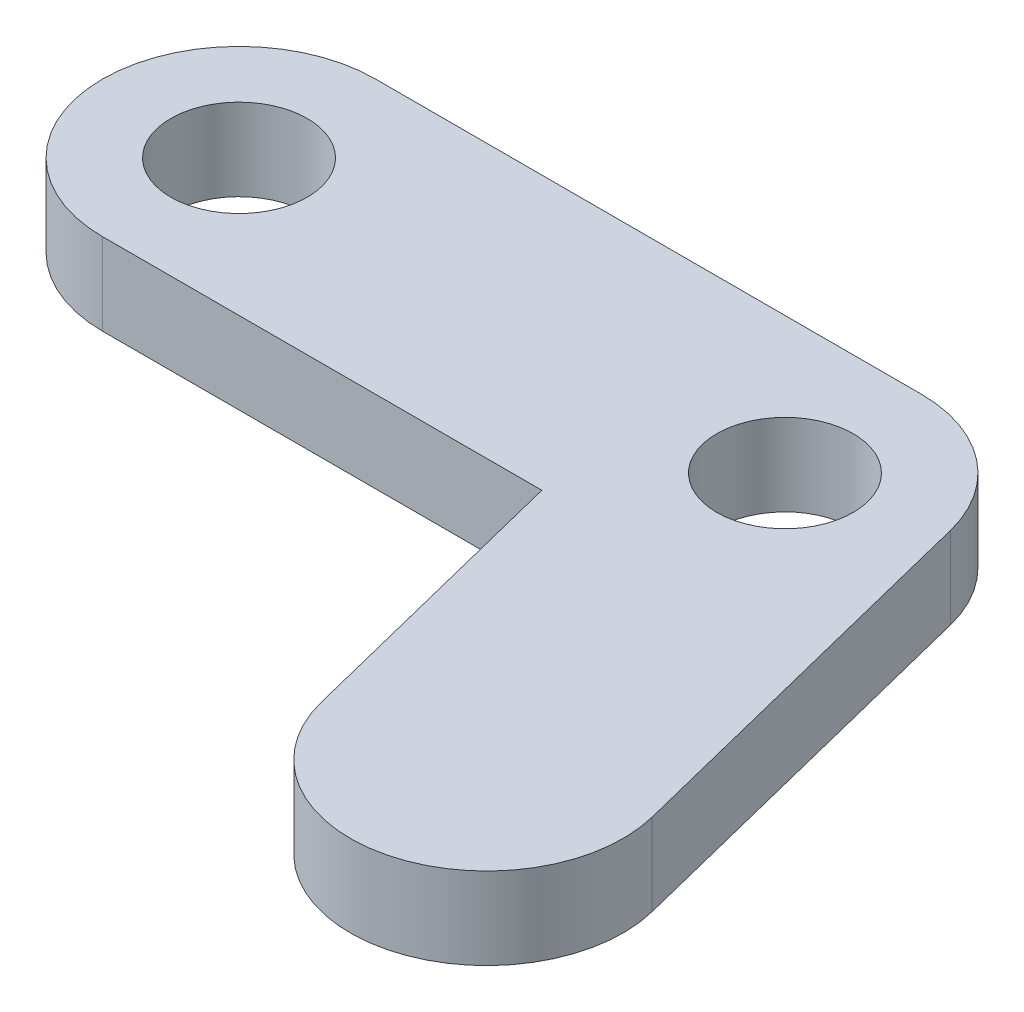
ISO-10303-21;
HEADER;
FILE_DESCRIPTION(('STEP AP214'),'2;1');
FILE_NAME('part.step','',(''),(''),'','','');
FILE_SCHEMA(('AUTOMOTIVE_DESIGN { 1 0 10303 214 1 1 1 1 }'));
ENDSEC;
DATA;
#1=APPLICATION_CONTEXT('core data for automotive mechanical design processes');
#2=APPLICATION_PROTOCOL_DEFINITION('international standard','automotive_design',2000,#1);
#3=PRODUCT_CONTEXT('',#1,'mechanical');
#4=PRODUCT('Part','Part','',(#3));
#5=PRODUCT_RELATED_PRODUCT_CATEGORY('part','',(#4));
#6=PRODUCT_DEFINITION_FORMATION('','',#4);
#7=PRODUCT_DEFINITION_CONTEXT('part definition',#1,'design');
#8=PRODUCT_DEFINITION('design','',#6,#7);
#9=PRODUCT_DEFINITION_SHAPE('','',#8);
#10=(LENGTH_UNIT() NAMED_UNIT(*) SI_UNIT(.MILLI.,.METRE.));
#11=(NAMED_UNIT(*) PLANE_ANGLE_UNIT() SI_UNIT($,.RADIAN.));
#12=(NAMED_UNIT(*) SI_UNIT($,.STERADIAN.) SOLID_ANGLE_UNIT());
#13=UNCERTAINTY_MEASURE_WITH_UNIT(LENGTH_MEASURE(1.E-05),#10,'distance_accuracy_value','');
#14=(GEOMETRIC_REPRESENTATION_CONTEXT(3) GLOBAL_UNCERTAINTY_ASSIGNED_CONTEXT((#13)) GLOBAL_UNIT_ASSIGNED_CONTEXT((#10,
#11,#12)) REPRESENTATION_CONTEXT('',''));
#15=CARTESIAN_POINT('',(0.,0.,0.));
#16=DIRECTION('',(0.,0.,1.));
#17=DIRECTION('',(1.,0.,0.));
#18=AXIS2_PLACEMENT_3D('',#15,#16,#17);
#19=CARTESIAN_POINT('',(23.6809545599693,3.,-5.90432510585719));
#20=DIRECTION('',(0.970295726275997,0.,-0.241921895599665));
#21=DIRECTION('',(-0.241921895599665,0.,-0.970295726275997));
#22=AXIS2_PLACEMENT_3D('',#19,#20,#21);
#23=PLANE('',#22);
#24=DIRECTION('',(0.241921895599665,0.,0.970295726275997));
#25=VECTOR('',#24,1.);
#26=CARTESIAN_POINT('',(23.6809545599693,0.,-5.90432510585719));
#27=LINE('',#26,#25);
#28=CARTESIAN_POINT('',(24.85147863138,0.,-1.20960947799832));
#29=VERTEX_POINT('',#28);
#30=CARTESIAN_POINT('',(28.480307065375,0.,13.3448264161416));
#31=VERTEX_POINT('',#30);
#32=EDGE_CURVE('E143',#29,#31,#27,.T.);
#33=ORIENTED_EDGE('',*,*,#32,.F.);
#34=DIRECTION('',(0.,-1.,0.));
#35=VECTOR('',#34,1.);
#36=CARTESIAN_POINT('',(24.85147863138,3.,-1.20960947799832));
#37=LINE('',#36,#35);
#38=CARTESIAN_POINT('',(24.85147863138,3.,-1.20960947799832));
#39=VERTEX_POINT('',#38);
#40=EDGE_CURVE('E11',#39,#29,#37,.T.);
#41=ORIENTED_EDGE('',*,*,#40,.F.);
#42=DIRECTION('',(0.241921895599665,0.,0.970295726275997));
#43=VECTOR('',#42,1.);
#44=CARTESIAN_POINT('',(23.6809545599693,3.,-5.90432510585719));
#45=LINE('',#44,#43);
#46=CARTESIAN_POINT('',(28.480307065375,3.,13.3448264161416));
#47=VERTEX_POINT('',#46);
#48=EDGE_CURVE('E173',#39,#47,#45,.T.);
#49=ORIENTED_EDGE('',*,*,#48,.T.);
#50=DIRECTION('',(0.,-1.,0.));
#51=VECTOR('',#50,1.);
#52=CARTESIAN_POINT('',(28.480307065375,3.,13.3448264161416));
#53=LINE('',#52,#51);
#54=EDGE_CURVE('E90',#47,#31,#53,.T.);
#55=ORIENTED_EDGE('',*,*,#54,.T.);
#56=EDGE_LOOP('',(#33,#41,#49,#55));
#57=FACE_BOUND('',#56,.T.);
#58=ADVANCED_FACE('F41',(#57),#23,.T.);
#59=CARTESIAN_POINT('',(20.,3.,0.));
#60=DIRECTION('',(0.,-1.,0.));
#61=DIRECTION('',(0.,0.,-1.));
#62=AXIS2_PLACEMENT_3D('',#59,#60,#61);
#63=CYLINDRICAL_SURFACE('',#62,5.);
#64=CARTESIAN_POINT('',(20.,0.,0.));
#65=DIRECTION('',(0.,1.,0.));
#66=DIRECTION('',(0.,0.,1.));
#67=AXIS2_PLACEMENT_3D('',#64,#65,#66);
#68=CIRCLE('',#67,5.);
#69=CARTESIAN_POINT('',(20.,0.,-5.));
#70=VERTEX_POINT('',#69);
#71=EDGE_CURVE('E147',#29,#70,#68,.T.);
#72=ORIENTED_EDGE('',*,*,#71,.T.);
#73=DIRECTION('',(0.,-1.,0.));
#74=VECTOR('',#73,1.);
#75=CARTESIAN_POINT('',(20.,3.,-5.));
#76=LINE('',#75,#74);
#77=CARTESIAN_POINT('',(20.,3.,-5.));
#78=VERTEX_POINT('',#77);
#79=EDGE_CURVE('E50',#78,#70,#76,.T.);
#80=ORIENTED_EDGE('',*,*,#79,.F.);
#81=CARTESIAN_POINT('',(20.,3.,0.));
#82=DIRECTION('',(0.,1.,0.));
#83=DIRECTION('',(0.,0.,1.));
#84=AXIS2_PLACEMENT_3D('',#81,#82,#83);
#85=CIRCLE('',#84,5.);
#86=EDGE_CURVE('E199',#39,#78,#85,.T.);
#87=ORIENTED_EDGE('',*,*,#86,.F.);
#88=ORIENTED_EDGE('',*,*,#40,.T.);
#89=EDGE_LOOP('',(#72,#80,#87,#88));
#90=FACE_BOUND('',#89,.T.);
#91=ADVANCED_FACE('F191',(#90),#63,.T.);
#92=CARTESIAN_POINT('',(0.,3.,-5.));
#93=DIRECTION('',(0.,0.,-1.));
#94=DIRECTION('',(-1.,0.,0.));
#95=AXIS2_PLACEMENT_3D('',#92,#93,#94);
#96=PLANE('',#95);
#97=DIRECTION('',(1.,0.,0.));
#98=VECTOR('',#97,1.);
#99=CARTESIAN_POINT('',(0.,0.,-5.));
#100=LINE('',#99,#98);
#101=CARTESIAN_POINT('',(0.,0.,-5.));
#102=VERTEX_POINT('',#101);
#103=EDGE_CURVE('E151',#102,#70,#100,.T.);
#104=ORIENTED_EDGE('',*,*,#103,.F.);
#105=DIRECTION('',(0.,-1.,0.));
#106=VECTOR('',#105,1.);
#107=CARTESIAN_POINT('',(0.,3.,-5.));
#108=LINE('',#107,#106);
#109=CARTESIAN_POINT('',(0.,3.,-5.));
#110=VERTEX_POINT('',#109);
#111=EDGE_CURVE('E180',#110,#102,#108,.T.);
#112=ORIENTED_EDGE('',*,*,#111,.F.);
#113=DIRECTION('',(1.,0.,0.));
#114=VECTOR('',#113,1.);
#115=CARTESIAN_POINT('',(0.,3.,-5.));
#116=LINE('',#115,#114);
#117=EDGE_CURVE('E188',#110,#78,#116,.T.);
#118=ORIENTED_EDGE('',*,*,#117,.T.);
#119=ORIENTED_EDGE('',*,*,#79,.T.);
#120=EDGE_LOOP('',(#104,#112,#118,#119));
#121=FACE_BOUND('',#120,.T.);
#122=ADVANCED_FACE('F187',(#121),#96,.T.);
#123=CARTESIAN_POINT('',(0.,3.,0.));
#124=DIRECTION('',(0.,-1.,0.));
#125=DIRECTION('',(0.,0.,-1.));
#126=AXIS2_PLACEMENT_3D('',#123,#124,#125);
#127=CYLINDRICAL_SURFACE('',#126,5.);
#128=CARTESIAN_POINT('',(0.,0.,0.));
#129=DIRECTION('',(0.,1.,0.));
#130=DIRECTION('',(0.,0.,1.));
#131=AXIS2_PLACEMENT_3D('',#128,#129,#130);
#132=CIRCLE('',#131,5.);
#133=CARTESIAN_POINT('',(0.,0.,5.));
#134=VERTEX_POINT('',#133);
#135=EDGE_CURVE('E155',#102,#134,#132,.T.);
#136=ORIENTED_EDGE('',*,*,#135,.T.);
#137=DIRECTION('',(0.,-1.,0.));
#138=VECTOR('',#137,1.);
#139=CARTESIAN_POINT('',(0.,3.,5.));
#140=LINE('',#139,#138);
#141=CARTESIAN_POINT('',(0.,3.,5.));
#142=VERTEX_POINT('',#141);
#143=EDGE_CURVE('E125',#142,#134,#140,.T.);
#144=ORIENTED_EDGE('',*,*,#143,.F.);
#145=CARTESIAN_POINT('',(0.,3.,0.));
#146=DIRECTION('',(0.,1.,0.));
#147=DIRECTION('',(0.,0.,1.));
#148=AXIS2_PLACEMENT_3D('',#145,#146,#147);
#149=CIRCLE('',#148,5.);
#150=EDGE_CURVE('E114',#110,#142,#149,.T.);
#151=ORIENTED_EDGE('',*,*,#150,.F.);
#152=ORIENTED_EDGE('',*,*,#111,.T.);
#153=EDGE_LOOP('',(#136,#144,#151,#152));
#154=FACE_BOUND('',#153,.T.);
#155=ADVANCED_FACE('F197',(#154),#127,.T.);
#156=CARTESIAN_POINT('',(0.,3.,5.));
#157=DIRECTION('',(0.,0.,-1.));
#158=DIRECTION('',(-1.,0.,0.));
#159=AXIS2_PLACEMENT_3D('',#156,#157,#158);
#160=PLANE('',#159);
#161=DIRECTION('',(1.,0.,0.));
#162=VECTOR('',#161,1.);
#163=CARTESIAN_POINT('',(0.,0.,5.));
#164=LINE('',#163,#162);
#165=CARTESIAN_POINT('',(16.0935718674664,0.,5.));
#166=VERTEX_POINT('',#165);
#167=EDGE_CURVE('E123',#134,#166,#164,.T.);
#168=ORIENTED_EDGE('',*,*,#167,.T.);
#169=DIRECTION('',(0.,-1.,0.));
#170=VECTOR('',#169,1.);
#171=CARTESIAN_POINT('',(16.0935718674664,3.,5.));
#172=LINE('',#171,#170);
#173=CARTESIAN_POINT('',(16.0935718674664,3.,5.));
#174=VERTEX_POINT('',#173);
#175=EDGE_CURVE('E120',#174,#166,#172,.T.);
#176=ORIENTED_EDGE('',*,*,#175,.F.);
#177=DIRECTION('',(1.,0.,0.));
#178=VECTOR('',#177,1.);
#179=CARTESIAN_POINT('',(0.,3.,5.));
#180=LINE('',#179,#178);
#181=EDGE_CURVE('E106',#142,#174,#180,.T.);
#182=ORIENTED_EDGE('',*,*,#181,.F.);
#183=ORIENTED_EDGE('',*,*,#143,.T.);
#184=EDGE_LOOP('',(#168,#176,#182,#183));
#185=FACE_BOUND('',#184,.T.);
#186=ADVANCED_FACE('F121',(#185),#160,.F.);
#187=CARTESIAN_POINT('',(13.9779972972093,3.,-3.48510614986053));
#188=DIRECTION('',(0.970295726275997,0.,-0.241921895599664));
#189=DIRECTION('',(-0.241921895599664,0.,-0.970295726275997));
#190=AXIS2_PLACEMENT_3D('',#187,#188,#189);
#191=PLANE('',#190);
#192=DIRECTION('',(0.241921895599664,0.,0.970295726275997));
#193=VECTOR('',#192,1.);
#194=CARTESIAN_POINT('',(13.9779972972093,0.,-3.48510614986053));
#195=LINE('',#194,#193);
#196=CARTESIAN_POINT('',(18.777349802615,0.,15.7640453721383));
#197=VERTEX_POINT('',#196);
#198=EDGE_CURVE('E83',#166,#197,#195,.T.);
#199=ORIENTED_EDGE('',*,*,#198,.T.);
#200=DIRECTION('',(0.,-1.,0.));
#201=VECTOR('',#200,1.);
#202=CARTESIAN_POINT('',(18.777349802615,3.,15.7640453721383));
#203=LINE('',#202,#201);
#204=CARTESIAN_POINT('',(18.777349802615,3.,15.7640453721383));
#205=VERTEX_POINT('',#204);
#206=EDGE_CURVE('E126',#205,#197,#203,.T.);
#207=ORIENTED_EDGE('',*,*,#206,.F.);
#208=DIRECTION('',(0.241921895599664,0.,0.970295726275997));
#209=VECTOR('',#208,1.);
#210=CARTESIAN_POINT('',(13.9779972972093,3.,-3.48510614986053));
#211=LINE('',#210,#209);
#212=EDGE_CURVE('E111',#174,#205,#211,.T.);
#213=ORIENTED_EDGE('',*,*,#212,.F.);
#214=ORIENTED_EDGE('',*,*,#175,.T.);
#215=EDGE_LOOP('',(#199,#207,#213,#214));
#216=FACE_BOUND('',#215,.T.);
#217=ADVANCED_FACE('F128',(#216),#191,.F.);
#218=CARTESIAN_POINT('',(0.,3.,0.));
#219=DIRECTION('',(0.,-1.,0.));
#220=DIRECTION('',(0.,0.,-1.));
#221=AXIS2_PLACEMENT_3D('',#218,#219,#220);
#222=CYLINDRICAL_SURFACE('',#221,2.5);
#223=CARTESIAN_POINT('',(0.,3.,0.));
#224=DIRECTION('',(0.,1.,0.));
#225=DIRECTION('',(0.,0.,1.));
#226=AXIS2_PLACEMENT_3D('',#223,#224,#225);
#227=CIRCLE('',#226,2.5);
#228=CARTESIAN_POINT('',(0.,3.,2.5));
#229=VERTEX_POINT('',#228);
#230=EDGE_CURVE('E132',#229,#229,#227,.T.);
#231=ORIENTED_EDGE('',*,*,#230,.T.);
#232=EDGE_LOOP('',(#231));
#233=FACE_BOUND('',#232,.T.);
#234=CARTESIAN_POINT('',(0.,0.,0.));
#235=DIRECTION('',(0.,1.,0.));
#236=DIRECTION('',(0.,0.,1.));
#237=AXIS2_PLACEMENT_3D('',#234,#235,#236);
#238=CIRCLE('',#237,2.5);
#239=CARTESIAN_POINT('',(0.,0.,2.5));
#240=VERTEX_POINT('',#239);
#241=EDGE_CURVE('E165',#240,#240,#238,.T.);
#242=ORIENTED_EDGE('',*,*,#241,.F.);
#243=EDGE_LOOP('',(#242));
#244=FACE_BOUND('',#243,.T.);
#245=ADVANCED_FACE('F221',(#233,#244),#222,.F.);
#246=CARTESIAN_POINT('',(23.628828433995,3.,14.55443589414));
#247=DIRECTION('',(0.,-1.,0.));
#248=DIRECTION('',(0.,0.,-1.));
#249=AXIS2_PLACEMENT_3D('',#246,#247,#248);
#250=CYLINDRICAL_SURFACE('',#249,5.);
#251=CARTESIAN_POINT('',(23.628828433995,0.,14.55443589414));
#252=DIRECTION('',(0.,1.,0.));
#253=DIRECTION('',(0.,0.,1.));
#254=AXIS2_PLACEMENT_3D('',#251,#252,#253);
#255=CIRCLE('',#254,5.);
#256=EDGE_CURVE('E162',#197,#31,#255,.T.);
#257=ORIENTED_EDGE('',*,*,#256,.T.);
#258=ORIENTED_EDGE('',*,*,#54,.F.);
#259=CARTESIAN_POINT('',(23.628828433995,3.,14.55443589414));
#260=DIRECTION('',(0.,1.,0.));
#261=DIRECTION('',(0.,0.,1.));
#262=AXIS2_PLACEMENT_3D('',#259,#260,#261);
#263=CIRCLE('',#262,5.);
#264=EDGE_CURVE('E58',#205,#47,#263,.T.);
#265=ORIENTED_EDGE('',*,*,#264,.F.);
#266=ORIENTED_EDGE('',*,*,#206,.T.);
#267=EDGE_LOOP('',(#257,#258,#265,#266));
#268=FACE_BOUND('',#267,.T.);
#269=ADVANCED_FACE('F222',(#268),#250,.T.);
#270=CARTESIAN_POINT('',(20.,3.,0.));
#271=DIRECTION('',(0.,-1.,0.));
#272=DIRECTION('',(0.,0.,-1.));
#273=AXIS2_PLACEMENT_3D('',#270,#271,#272);
#274=CYLINDRICAL_SURFACE('',#273,2.49999999999999);
#275=CARTESIAN_POINT('',(20.,3.,0.));
#276=DIRECTION('',(0.,1.,0.));
#277=DIRECTION('',(0.,0.,1.));
#278=AXIS2_PLACEMENT_3D('',#275,#276,#277);
#279=CIRCLE('',#278,2.49999999999999);
#280=CARTESIAN_POINT('',(20.,3.,2.49999999999999));
#281=VERTEX_POINT('',#280);
#282=EDGE_CURVE('E139',#281,#281,#279,.T.);
#283=ORIENTED_EDGE('',*,*,#282,.T.);
#284=EDGE_LOOP('',(#283));
#285=FACE_BOUND('',#284,.T.);
#286=CARTESIAN_POINT('',(20.,0.,0.));
#287=DIRECTION('',(0.,1.,0.));
#288=DIRECTION('',(0.,0.,1.));
#289=AXIS2_PLACEMENT_3D('',#286,#287,#288);
#290=CIRCLE('',#289,2.49999999999999);
#291=CARTESIAN_POINT('',(20.,0.,2.49999999999999));
#292=VERTEX_POINT('',#291);
#293=EDGE_CURVE('E169',#292,#292,#290,.T.);
#294=ORIENTED_EDGE('',*,*,#293,.F.);
#295=EDGE_LOOP('',(#294));
#296=FACE_BOUND('',#295,.T.);
#297=ADVANCED_FACE('F225',(#285,#296),#274,.F.);
#298=CARTESIAN_POINT('',(0.,3.,0.));
#299=DIRECTION('',(0.,1.,0.));
#300=DIRECTION('',(0.,0.,1.));
#301=AXIS2_PLACEMENT_3D('',#298,#299,#300);
#302=PLANE('',#301);
#303=ORIENTED_EDGE('',*,*,#48,.F.);
#304=ORIENTED_EDGE('',*,*,#86,.T.);
#305=ORIENTED_EDGE('',*,*,#117,.F.);
#306=ORIENTED_EDGE('',*,*,#150,.T.);
#307=ORIENTED_EDGE('',*,*,#181,.T.);
#308=ORIENTED_EDGE('',*,*,#212,.T.);
#309=ORIENTED_EDGE('',*,*,#264,.T.);
#310=EDGE_LOOP('',(#303,#304,#305,#306,#307,#308,#309));
#311=FACE_BOUND('',#310,.T.);
#312=ORIENTED_EDGE('',*,*,#230,.F.);
#313=EDGE_LOOP('',(#312));
#314=FACE_BOUND('',#313,.T.);
#315=ORIENTED_EDGE('',*,*,#282,.F.);
#316=EDGE_LOOP('',(#315));
#317=FACE_BOUND('',#316,.T.);
#318=ADVANCED_FACE('F108',(#311,#314,#317),#302,.T.);
#319=CARTESIAN_POINT('',(0.,0.,0.));
#320=DIRECTION('',(0.,1.,0.));
#321=DIRECTION('',(0.,0.,1.));
#322=AXIS2_PLACEMENT_3D('',#319,#320,#321);
#323=PLANE('',#322);
#324=ORIENTED_EDGE('',*,*,#32,.T.);
#325=ORIENTED_EDGE('',*,*,#256,.F.);
#326=ORIENTED_EDGE('',*,*,#198,.F.);
#327=ORIENTED_EDGE('',*,*,#167,.F.);
#328=ORIENTED_EDGE('',*,*,#135,.F.);
#329=ORIENTED_EDGE('',*,*,#103,.T.);
#330=ORIENTED_EDGE('',*,*,#71,.F.);
#331=EDGE_LOOP('',(#324,#325,#326,#327,#328,#329,#330));
#332=FACE_BOUND('',#331,.T.);
#333=ORIENTED_EDGE('',*,*,#241,.T.);
#334=EDGE_LOOP('',(#333));
#335=FACE_BOUND('',#334,.T.);
#336=ORIENTED_EDGE('',*,*,#293,.T.);
#337=EDGE_LOOP('',(#336));
#338=FACE_BOUND('',#337,.T.);
#339=ADVANCED_FACE('F194',(#332,#335,#338),#323,.F.);
#340=CLOSED_SHELL('',(#58,#91,#122,#155,#186,#217,#245,#269,#297,#318,#339));
#341=MANIFOLD_SOLID_BREP('B2',#340);
#342=ADVANCED_BREP_SHAPE_REPRESENTATION('',(#18,#341),#14);
#343=SHAPE_DEFINITION_REPRESENTATION(#9,#342);
ENDSEC;
END-ISO-10303-21;
